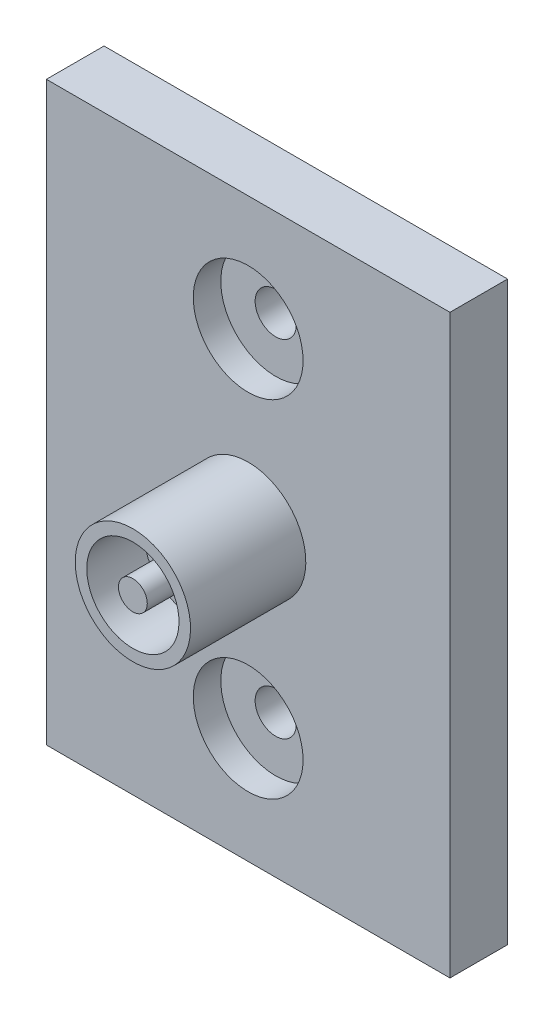
ISO-10303-21;
HEADER;
FILE_DESCRIPTION(('STEP AP214'),'2;1');
FILE_NAME('part.step','',(''),(''),'','','');
FILE_SCHEMA(('AUTOMOTIVE_DESIGN { 1 0 10303 214 1 1 1 1 }'));
ENDSEC;
DATA;
#1=APPLICATION_CONTEXT('core data for automotive mechanical design processes');
#2=APPLICATION_PROTOCOL_DEFINITION('international standard','automotive_design',2000,#1);
#3=PRODUCT_CONTEXT('',#1,'mechanical');
#4=PRODUCT('Part','Part','',(#3));
#5=PRODUCT_RELATED_PRODUCT_CATEGORY('part','',(#4));
#6=PRODUCT_DEFINITION_FORMATION('','',#4);
#7=PRODUCT_DEFINITION_CONTEXT('part definition',#1,'design');
#8=PRODUCT_DEFINITION('design','',#6,#7);
#9=PRODUCT_DEFINITION_SHAPE('','',#8);
#10=(LENGTH_UNIT() NAMED_UNIT(*) SI_UNIT(.MILLI.,.METRE.));
#11=(NAMED_UNIT(*) PLANE_ANGLE_UNIT() SI_UNIT($,.RADIAN.));
#12=(NAMED_UNIT(*) SI_UNIT($,.STERADIAN.) SOLID_ANGLE_UNIT());
#13=UNCERTAINTY_MEASURE_WITH_UNIT(LENGTH_MEASURE(1.E-05),#10,'distance_accuracy_value','');
#14=(GEOMETRIC_REPRESENTATION_CONTEXT(3) GLOBAL_UNCERTAINTY_ASSIGNED_CONTEXT((#13)) GLOBAL_UNIT_ASSIGNED_CONTEXT((#10,
#11,#12)) REPRESENTATION_CONTEXT('',''));
#15=CARTESIAN_POINT('',(0.,0.,0.));
#16=DIRECTION('',(0.,0.,1.));
#17=DIRECTION('',(1.,0.,0.));
#18=AXIS2_PLACEMENT_3D('',#15,#16,#17);
#19=CARTESIAN_POINT('',(0.,0.,5.));
#20=DIRECTION('',(0.,0.,-1.));
#21=DIRECTION('',(-1.,0.,0.));
#22=AXIS2_PLACEMENT_3D('',#19,#20,#21);
#23=PLANE('',#22);
#24=CARTESIAN_POINT('',(0.,0.,5.));
#25=DIRECTION('',(0.,0.,-1.));
#26=DIRECTION('',(0.,1.,0.));
#27=AXIS2_PLACEMENT_3D('',#24,#25,#26);
#28=CIRCLE('',#27,6.);
#29=CARTESIAN_POINT('',(0.,6.,5.));
#30=VERTEX_POINT('',#29);
#31=EDGE_CURVE('E123',#30,#30,#28,.T.);
#32=ORIENTED_EDGE('',*,*,#31,.F.);
#33=EDGE_LOOP('',(#32));
#34=FACE_BOUND('',#33,.T.);
#35=CARTESIAN_POINT('',(0.,0.,5.));
#36=DIRECTION('',(0.,0.,-1.));
#37=DIRECTION('',(-1.,0.,0.));
#38=AXIS2_PLACEMENT_3D('',#35,#36,#37);
#39=CIRCLE('',#38,2.5);
#40=CARTESIAN_POINT('',(-2.5,0.,5.));
#41=VERTEX_POINT('',#40);
#42=EDGE_CURVE('E11',#41,#41,#39,.F.);
#43=ORIENTED_EDGE('',*,*,#42,.F.);
#44=EDGE_LOOP('',(#43));
#45=FACE_BOUND('',#44,.T.);
#46=ADVANCED_FACE('F35',(#34,#45),#23,.F.);
#47=CARTESIAN_POINT('',(0.,0.,25.));
#48=DIRECTION('',(0.,0.,-1.));
#49=DIRECTION('',(-1.,0.,0.));
#50=AXIS2_PLACEMENT_3D('',#47,#48,#49);
#51=CYLINDRICAL_SURFACE('',#50,2.5);
#52=CARTESIAN_POINT('',(0.,0.,25.));
#53=DIRECTION('',(0.,0.,1.));
#54=DIRECTION('',(1.,0.,0.));
#55=AXIS2_PLACEMENT_3D('',#52,#53,#54);
#56=CIRCLE('',#55,2.5);
#57=CARTESIAN_POINT('',(2.5,0.,25.));
#58=VERTEX_POINT('',#57);
#59=EDGE_CURVE('E132',#58,#58,#56,.T.);
#60=ORIENTED_EDGE('',*,*,#59,.F.);
#61=EDGE_LOOP('',(#60));
#62=FACE_BOUND('',#61,.T.);
#63=ORIENTED_EDGE('',*,*,#42,.T.);
#64=EDGE_LOOP('',(#63));
#65=FACE_BOUND('',#64,.T.);
#66=ADVANCED_FACE('F186',(#62,#65),#51,.T.);
#67=CARTESIAN_POINT('',(0.,0.,25.));
#68=DIRECTION('',(0.,0.,1.));
#69=DIRECTION('',(1.,0.,0.));
#70=AXIS2_PLACEMENT_3D('',#67,#68,#69);
#71=PLANE('',#70);
#72=ORIENTED_EDGE('',*,*,#59,.T.);
#73=EDGE_LOOP('',(#72));
#74=FACE_BOUND('',#73,.T.);
#75=ADVANCED_FACE('F191',(#74),#71,.T.);
#76=CARTESIAN_POINT('',(0.,0.,0.));
#77=DIRECTION('',(0.,0.,-1.));
#78=DIRECTION('',(0.,1.,0.));
#79=AXIS2_PLACEMENT_3D('',#76,#77,#78);
#80=CYLINDRICAL_SURFACE('',#79,6.);
#81=CARTESIAN_POINT('',(-5.85906209348199,-1.29282302915844,15.));
#82=CARTESIAN_POINT('',(-5.8544487562277,-1.31372606120363,14.9644716502933));
#83=CARTESIAN_POINT('',(-5.85004280632662,-1.33316761483905,14.9280773081318));
#84=CARTESIAN_POINT('',(-5.8417591789342,-1.36901045878219,14.8537590894942));
#85=CARTESIAN_POINT('',(-5.83788155688046,-1.38541143010561,14.815835053047));
#86=CARTESIAN_POINT('',(-5.82721999406738,-1.42984164551734,14.7001609310232));
#87=CARTESIAN_POINT('',(-5.82139765676853,-1.45314054941397,14.6204368101892));
#88=CARTESIAN_POINT('',(-5.81302193184723,-1.48629491441645,14.4580025841804));
#89=CARTESIAN_POINT('',(-5.8104726096231,-1.49613365770553,14.3752888964652));
#90=CARTESIAN_POINT('',(-5.8089608620628,-1.50199339022866,14.2093761232951));
#91=CARTESIAN_POINT('',(-5.80999633577826,-1.49802247291131,14.1261773506709));
#92=CARTESIAN_POINT('',(-5.81548374299934,-1.47657213668072,13.9628959733192));
#93=CARTESIAN_POINT('',(-5.81988599867121,-1.45928911545826,13.8827856927722));
#94=CARTESIAN_POINT('',(-5.83153660273639,-1.4120087375848,13.7266072302169));
#95=CARTESIAN_POINT('',(-5.8387859712411,-1.38200682348893,13.6505405081059));
#96=CARTESIAN_POINT('',(-5.85542910446555,-1.309708954435,13.5034943733968));
#97=CARTESIAN_POINT('',(-5.86484988593087,-1.26725609970193,13.4325952721467));
#98=CARTESIAN_POINT('',(-5.88474426636395,-1.17139870542558,13.2988052370785));
#99=CARTESIAN_POINT('',(-5.89521794744936,-1.11799331133447,13.2359149287498));
#100=CARTESIAN_POINT('',(-5.91639592076801,-0.999972723964718,13.1180879472285));
#101=CARTESIAN_POINT('',(-5.92709848710393,-0.935086182853992,13.0634223657917));
#102=CARTESIAN_POINT('',(-5.94725302471428,-0.796900010668155,12.9657156571659));
#103=CARTESIAN_POINT('',(-5.95670495248499,-0.723600087097353,12.9226749342958));
#104=CARTESIAN_POINT('',(-5.97330598353017,-0.570555647347051,12.8494950673779));
#105=CARTESIAN_POINT('',(-5.98045482079961,-0.490810388066224,12.8193574134918));
#106=CARTESIAN_POINT('',(-5.99163389689685,-0.327169893083612,12.7729847594656));
#107=CARTESIAN_POINT('',(-5.9956647687521,-0.243275503444221,12.7567469372296));
#108=CARTESIAN_POINT('',(-6.00008465733115,-0.0760999052779219,12.7389742258584));
#109=CARTESIAN_POINT('',(-6.0005672001127,0.0071388079690795,12.737061727456));
#110=CARTESIAN_POINT('',(-5.99808466622656,0.172731674763288,12.7470088125307));
#111=CARTESIAN_POINT('',(-5.99511983549212,0.255085890986924,12.7588674135869));
#112=CARTESIAN_POINT('',(-5.9861254729971,0.415556834781913,12.7957268187328));
#113=CARTESIAN_POINT('',(-5.98013351071375,0.493712816041675,12.8205666411021));
#114=CARTESIAN_POINT('',(-5.96573954991216,0.64475844924185,12.8825198152639));
#115=CARTESIAN_POINT('',(-5.95733726652666,0.717647477424377,12.919634617872));
#116=CARTESIAN_POINT('',(-5.93881021144866,0.857686563265595,13.0059377192327));
#117=CARTESIAN_POINT('',(-5.92865441211307,0.924693067757615,13.0553521745377));
#118=CARTESIAN_POINT('',(-5.90782291147737,1.04959277055555,13.1645172969174));
#119=CARTESIAN_POINT('',(-5.89714713064798,1.10748456903325,13.2242695487095));
#120=CARTESIAN_POINT('',(-5.87618277165367,1.21387383534614,13.3540621638012));
#121=CARTESIAN_POINT('',(-5.86590877502954,1.26212421914305,13.4243077882875));
#122=CARTESIAN_POINT('',(-5.8472032468319,1.34613320113975,13.572139896401));
#123=CARTESIAN_POINT('',(-5.83877163798129,1.3818923233106,13.6497260719405));
#124=CARTESIAN_POINT('',(-5.82483041593197,1.43952347086736,13.8093329646687));
#125=CARTESIAN_POINT('',(-5.81929442313821,1.46152123922698,13.8913058698209));
#126=CARTESIAN_POINT('',(-5.81171138318686,1.49139324359333,14.0579376457271));
#127=CARTESIAN_POINT('',(-5.80966352589534,1.4992707591096,14.1425958881462));
#128=CARTESIAN_POINT('',(-5.80931642110299,1.5006134285204,14.3096130443981));
#129=CARTESIAN_POINT('',(-5.81091240033262,1.49448140320018,14.3919690017465));
#130=CARTESIAN_POINT('',(-5.81744819149207,1.46883261119017,14.5544330656184));
#131=CARTESIAN_POINT('',(-5.82238704718621,1.4493196721132,14.6345418081387));
#132=CARTESIAN_POINT('',(-5.83277456866213,1.4067797625948,14.7625734399563));
#133=CARTESIAN_POINT('',(-5.83742039444129,1.38745696170044,14.8118300560542));
#134=CARTESIAN_POINT('',(-5.84761840445142,1.34381898779569,14.9078638209715));
#135=CARTESIAN_POINT('',(-5.85316878010901,1.31951375224977,14.9546456755802));
#136=CARTESIAN_POINT('',(-5.85906209348199,1.29282302915844,15.));
#137=B_SPLINE_CURVE_WITH_KNOTS('',3,(#81,#82,#83,#84,#85,#86,#87,#88,#89,#90,#91,#92,#93,#94,
#95,#96,#97,#98,#99,#100,#101,#102,#103,#104,#105,#106,#107,#108,#109,#110,#111,#112,#113,#114,
#115,#116,#117,#118,#119,#120,#121,#122,#123,#124,#125,#126,#127,#128,#129,#130,#131,#132,#133,
#134,#135,#136),.UNSPECIFIED.,.F.,.F.,(4,2,2,2,2,2,2,2,2,2,2,2,2,2,2,2,2,2,2,2,2,2,2,2,2,2,2,4),
(0.,0.124364148412423,0.248741336362965,0.497246506346483,0.746060045883647,0.994727787475496,
1.23979551370782,1.48495112714358,1.73333951174834,1.98174728368913,2.23709063544472,
2.49244286703729,2.74782458103544,3.00315443233675,3.25172939431283,3.50028662421137,
3.74583215007225,3.99140670804812,4.24188191791826,4.49239555809707,4.74867910689668,
5.00495190407671,5.25884745416729,5.51268402791871,5.75931412582859,6.00587370456642,
6.1649391308357,6.32369033514945),.UNSPECIFIED.);
#138=CARTESIAN_POINT('',(-5.85906209348199,-1.29282302915844,15.));
#139=VERTEX_POINT('',#138);
#140=CARTESIAN_POINT('',(-5.85906209348199,1.29282302915844,15.));
#141=VERTEX_POINT('',#140);
#142=EDGE_CURVE('E117',#139,#141,#137,.T.);
#143=ORIENTED_EDGE('',*,*,#142,.F.);
#144=CARTESIAN_POINT('',(0.,0.,15.));
#145=DIRECTION('',(0.,0.,-1.));
#146=DIRECTION('',(0.,1.,0.));
#147=AXIS2_PLACEMENT_3D('',#144,#145,#146);
#148=CIRCLE('',#147,6.);
#149=EDGE_CURVE('E116',#141,#139,#148,.T.);
#150=ORIENTED_EDGE('',*,*,#149,.F.);
#151=EDGE_LOOP('',(#143,#150));
#152=FACE_BOUND('',#151,.T.);
#153=ORIENTED_EDGE('',*,*,#31,.T.);
#154=EDGE_LOOP('',(#153));
#155=FACE_BOUND('',#154,.T.);
#156=ADVANCED_FACE('F198',(#152,#155),#80,.F.);
#157=CARTESIAN_POINT('',(0.,6.,15.));
#158=DIRECTION('',(0.,0.,1.));
#159=DIRECTION('',(0.,-1.,0.));
#160=AXIS2_PLACEMENT_3D('',#157,#158,#159);
#161=PLANE('',#160);
#162=DIRECTION('',(1.,0.,0.));
#163=VECTOR('',#162,1.);
#164=CARTESIAN_POINT('',(-15.,-1.29282302915844,15.));
#165=LINE('',#164,#163);
#166=CARTESIAN_POINT('',(-7.89484696591882,-1.29282302915844,15.));
#167=VERTEX_POINT('',#166);
#168=EDGE_CURVE('E105',#167,#139,#165,.T.);
#169=ORIENTED_EDGE('',*,*,#168,.F.);
#170=CARTESIAN_POINT('',(0.,0.,15.));
#171=DIRECTION('',(0.,0.,-1.));
#172=DIRECTION('',(0.,1.,0.));
#173=AXIS2_PLACEMENT_3D('',#170,#171,#172);
#174=CIRCLE('',#173,8.);
#175=CARTESIAN_POINT('',(-7.89484696591882,1.29282302915844,15.));
#176=VERTEX_POINT('',#175);
#177=EDGE_CURVE('E114',#176,#167,#174,.T.);
#178=ORIENTED_EDGE('',*,*,#177,.F.);
#179=DIRECTION('',(1.,0.,0.));
#180=VECTOR('',#179,1.);
#181=CARTESIAN_POINT('',(-15.,1.29282302915844,15.));
#182=LINE('',#181,#180);
#183=EDGE_CURVE('E56',#141,#176,#182,.F.);
#184=ORIENTED_EDGE('',*,*,#183,.F.);
#185=ORIENTED_EDGE('',*,*,#149,.T.);
#186=EDGE_LOOP('',(#169,#178,#184,#185));
#187=FACE_BOUND('',#186,.T.);
#188=ADVANCED_FACE('F113',(#187),#161,.T.);
#189=CARTESIAN_POINT('',(0.,0.,0.));
#190=DIRECTION('',(0.,0.,-1.));
#191=DIRECTION('',(0.,1.,0.));
#192=AXIS2_PLACEMENT_3D('',#189,#190,#191);
#193=CYLINDRICAL_SURFACE('',#192,8.);
#194=CARTESIAN_POINT('',(-7.89484696591882,1.29282302915844,15.));
#195=CARTESIAN_POINT('',(-7.89836340267459,1.27134398944361,15.0365045488333));
#196=CARTESIAN_POINT('',(-7.90204177516243,1.24833660041329,15.0720695090708));
#197=CARTESIAN_POINT('',(-7.9096158574513,1.19941398132412,15.141111681313));
#198=CARTESIAN_POINT('',(-7.91351155251806,1.17349894828047,15.1745890345304));
#199=CARTESIAN_POINT('',(-7.9253559725285,1.09167745752591,15.2715053386545));
#200=CARTESIAN_POINT('',(-7.93347111768572,1.03164155209618,15.3315184691573));
#201=CARTESIAN_POINT('',(-7.94922098593206,0.902290074930788,15.4406040183404));
#202=CARTESIAN_POINT('',(-7.9568554991068,0.83297048934935,15.4896716800943));
#203=CARTESIAN_POINT('',(-7.97078730599558,0.686961979118036,15.5754675657897));
#204=CARTESIAN_POINT('',(-7.97708500356377,0.610275290280409,15.6121995183266));
#205=CARTESIAN_POINT('',(-7.98761059618587,0.452030963551578,15.6720942867126));
#206=CARTESIAN_POINT('',(-7.99184759067719,0.370496557278658,15.6953168467838));
#207=CARTESIAN_POINT('',(-7.99781420393323,0.204582301243765,15.7277214459038));
#208=CARTESIAN_POINT('',(-7.99954367257495,0.120202281427251,15.7369026443124));
#209=CARTESIAN_POINT('',(-8.00029168647187,-0.0476067552459982,15.7408926043652));
#210=CARTESIAN_POINT('',(-7.9993514685648,-0.131030468622181,15.7359199874924));
#211=CARTESIAN_POINT('',(-7.99495373828361,-0.295819563933918,15.7122313746471));
#212=CARTESIAN_POINT('',(-7.99149662494803,-0.377185270038382,15.6935175572547));
#213=CARTESIAN_POINT('',(-7.98245711745284,-0.535394503641412,15.6429869247903));
#214=CARTESIAN_POINT('',(-7.97687977516332,-0.612248283058419,15.6112012414419));
#215=CARTESIAN_POINT('',(-7.96420002499836,-0.759602588613385,15.535434953052));
#216=CARTESIAN_POINT('',(-7.95709674474642,-0.830099447640052,15.4914473679936));
#217=CARTESIAN_POINT('',(-7.94201749345682,-0.963825758399257,15.3917705443018));
#218=CARTESIAN_POINT('',(-7.93403000365688,-1.02692995803142,15.3359152586682));
#219=CARTESIAN_POINT('',(-7.91816805462666,-1.14282042535782,15.2145167126718));
#220=CARTESIAN_POINT('',(-7.91029339998464,-1.19562723819329,15.1489932109283));
#221=CARTESIAN_POINT('',(-7.90014552468695,-1.26016463057882,15.0535722362237));
#222=CARTESIAN_POINT('',(-7.89745024822377,-1.27692371406271,15.0270341896527));
#223=CARTESIAN_POINT('',(-7.89484696591882,-1.29282302915844,15.));
#224=B_SPLINE_CURVE_WITH_KNOTS('',3,(#194,#195,#196,#197,#198,#199,#200,#201,#202,#203,#204,
#205,#206,#207,#208,#209,#210,#211,#212,#213,#214,#215,#216,#217,#218,#219,#220,#221,#222,#223),
.UNSPECIFIED.,.F.,.F.,(4,2,2,2,2,2,2,2,2,2,2,2,2,2,4),(0.,0.127421791101567,0.254834953606647,
0.509350835913305,0.763977116845627,1.01852636494469,1.27194115904635,1.52537112420635,
1.77490792000268,2.02440516186305,2.27331161527216,2.52236074864473,2.7751556815891,
3.02744096331764,3.1218814125075),.UNSPECIFIED.);
#225=EDGE_CURVE('E101',#176,#167,#224,.T.);
#226=ORIENTED_EDGE('',*,*,#225,.F.);
#227=ORIENTED_EDGE('',*,*,#177,.T.);
#228=EDGE_LOOP('',(#226,#227));
#229=FACE_BOUND('',#228,.T.);
#230=CARTESIAN_POINT('',(0.,0.,25.));
#231=DIRECTION('',(0.,0.,-1.));
#232=DIRECTION('',(0.,1.,0.));
#233=AXIS2_PLACEMENT_3D('',#230,#231,#232);
#234=CIRCLE('',#233,8.00000000000001);
#235=CARTESIAN_POINT('',(0.,8.,25.));
#236=VERTEX_POINT('',#235);
#237=EDGE_CURVE('E121',#236,#236,#234,.T.);
#238=ORIENTED_EDGE('',*,*,#237,.F.);
#239=EDGE_LOOP('',(#238));
#240=FACE_BOUND('',#239,.T.);
#241=ADVANCED_FACE('F119',(#229,#240),#193,.F.);
#242=CARTESIAN_POINT('',(0.,8.,25.));
#243=DIRECTION('',(0.,0.,1.));
#244=DIRECTION('',(0.,-1.,0.));
#245=AXIS2_PLACEMENT_3D('',#242,#243,#244);
#246=PLANE('',#245);
#247=ORIENTED_EDGE('',*,*,#237,.T.);
#248=EDGE_LOOP('',(#247));
#249=FACE_BOUND('',#248,.T.);
#250=CARTESIAN_POINT('',(0.,0.,25.));
#251=DIRECTION('',(0.,0.,-1.));
#252=DIRECTION('',(0.,1.,0.));
#253=AXIS2_PLACEMENT_3D('',#250,#251,#252);
#254=CIRCLE('',#253,10.);
#255=CARTESIAN_POINT('',(0.,10.,25.));
#256=VERTEX_POINT('',#255);
#257=EDGE_CURVE('E126',#256,#256,#254,.T.);
#258=ORIENTED_EDGE('',*,*,#257,.F.);
#259=EDGE_LOOP('',(#258));
#260=FACE_BOUND('',#259,.T.);
#261=ADVANCED_FACE('F234',(#249,#260),#246,.T.);
#262=CARTESIAN_POINT('',(0.,0.,0.));
#263=DIRECTION('',(0.,0.,-1.));
#264=DIRECTION('',(0.,1.,0.));
#265=AXIS2_PLACEMENT_3D('',#262,#263,#264);
#266=CYLINDRICAL_SURFACE('',#265,10.);
#267=CARTESIAN_POINT('',(-10.,0.,12.7393367267459));
#268=CARTESIAN_POINT('',(-9.99999865771297,-0.0837515444816421,12.7393401805612));
#269=CARTESIAN_POINT('',(-9.9989368253704,-0.167551685082132,12.7463747275866));
#270=CARTESIAN_POINT('',(-9.99480315973187,-0.332809627994913,12.7743199267287));
#271=CARTESIAN_POINT('',(-9.99172936938474,-0.414265068974229,12.7952440896908));
#272=CARTESIAN_POINT('',(-9.98391721219526,-0.57241808622186,12.8503292317136));
#273=CARTESIAN_POINT('',(-9.9791801037092,-0.649119207826799,12.8844802062519));
#274=CARTESIAN_POINT('',(-9.96856475911725,-0.795690428635254,12.9650251061628));
#275=CARTESIAN_POINT('',(-9.96268668152774,-0.865561474725188,13.0114173311633));
#276=CARTESIAN_POINT('',(-9.95039170991453,-0.997046719562126,13.1155139916858));
#277=CARTESIAN_POINT('',(-9.94397133890332,-1.0585998322255,13.1732951829541));
#278=CARTESIAN_POINT('',(-9.93134261133239,-1.17117490668949,13.2983644156398));
#279=CARTESIAN_POINT('',(-9.92513426698506,-1.22219626272936,13.3656530035245));
#280=CARTESIAN_POINT('',(-9.91359877458726,-1.31249729499943,13.5082373702684));
#281=CARTESIAN_POINT('',(-9.90827611975032,-1.35171787037205,13.5835709737273));
#282=CARTESIAN_POINT('',(-9.89916211306268,-1.41692632171056,13.7398495473914));
#283=CARTESIAN_POINT('',(-9.89537067775449,-1.44291491889163,13.8207942114898));
#284=CARTESIAN_POINT('',(-9.88978256218674,-1.48073198798911,13.9853547686176));
#285=CARTESIAN_POINT('',(-9.88797115741251,-1.49266503640518,14.068946120154));
#286=CARTESIAN_POINT('',(-9.88650348970583,-1.50235624033932,14.2369628927332));
#287=CARTESIAN_POINT('',(-9.88684710303147,-1.50011520973796,14.3213882656084));
#288=CARTESIAN_POINT('',(-9.8896371835241,-1.48160733250788,14.4879378069401));
#289=CARTESIAN_POINT('',(-9.8920661876155,-1.4654569592775,14.5700752532307));
#290=CARTESIAN_POINT('',(-9.89872608126368,-1.41977117403734,14.7304610956175));
#291=CARTESIAN_POINT('',(-9.9029570217938,-1.39023538337812,14.8087093816267));
#292=CARTESIAN_POINT('',(-9.91276335545481,-1.31849603529736,14.9594500980288));
#293=CARTESIAN_POINT('',(-9.91834396766527,-1.27624314283198,15.0319186958383));
#294=CARTESIAN_POINT('',(-9.93021707574548,-1.18030413128955,15.1687813225279));
#295=CARTESIAN_POINT('',(-9.93650961832501,-1.12661726182478,15.2331748210153));
#296=CARTESIAN_POINT('',(-9.9491747305621,-1.00869493078248,15.3527343874856));
#297=CARTESIAN_POINT('',(-9.95554747112815,-0.944359329642002,15.4078017170323));
#298=CARTESIAN_POINT('',(-9.96759647648462,-0.807307089894187,15.5063726612532));
#299=CARTESIAN_POINT('',(-9.97327273822511,-0.734590414588171,15.5498762252898));
#300=CARTESIAN_POINT('',(-9.98329515585393,-0.582754598213687,15.6240898132455));
#301=CARTESIAN_POINT('',(-9.98764051925428,-0.503631677836781,15.6547922185862));
#302=CARTESIAN_POINT('',(-9.9945049055707,-0.341273182487062,15.7024461164313));
#303=CARTESIAN_POINT('',(-9.99702405195468,-0.258037885952602,15.7193985385615));
#304=CARTESIAN_POINT('',(-9.99993581133872,-0.0906695676436478,15.7389399565626));
#305=CARTESIAN_POINT('',(-10.0003485209039,-0.00655273187047159,15.7416646981253));
#306=CARTESIAN_POINT('',(-9.99905561015227,0.160936677662282,15.7330337214349));
#307=CARTESIAN_POINT('',(-9.99735005541369,0.244309274381876,15.7216784390778));
#308=CARTESIAN_POINT('',(-9.99202468615334,0.407532387431407,15.6853226265684));
#309=CARTESIAN_POINT('',(-9.98841415207985,0.487397963079838,15.6603882307151));
#310=CARTESIAN_POINT('',(-9.97968235658369,0.641814958643,15.5976517292842));
#311=CARTESIAN_POINT('',(-9.97456102421566,0.7163661287951,15.5598490194123));
#312=CARTESIAN_POINT('',(-9.96332682468687,0.85863497929192,15.4721305021821));
#313=CARTESIAN_POINT('',(-9.95720701626746,0.926299009891565,15.4221285867332));
#314=CARTESIAN_POINT('',(-9.94467863012165,1.05232367317771,15.3115509151172));
#315=CARTESIAN_POINT('',(-9.93827003562868,1.1106837647934,15.2509745444213));
#316=CARTESIAN_POINT('',(-9.92582264304494,1.21693784957195,15.1203631935694));
#317=CARTESIAN_POINT('',(-9.91978736017589,1.26474084747421,15.0502538015512));
#318=CARTESIAN_POINT('',(-9.90883219104904,1.34789129270584,14.9029206862342));
#319=CARTESIAN_POINT('',(-9.90391227465629,1.38323907656436,14.8256971552245));
#320=CARTESIAN_POINT('',(-9.89577033008645,1.44033467323943,14.6665991931228));
#321=CARTESIAN_POINT('',(-9.89254233006439,1.46213037141635,14.5847422657747));
#322=CARTESIAN_POINT('',(-9.88813382297803,1.49165549501586,14.4184777113108));
#323=CARTESIAN_POINT('',(-9.88695317451771,1.49938589183067,14.3340702607513));
#324=CARTESIAN_POINT('',(-9.88677832610842,1.5005378666944,14.1660076634302));
#325=CARTESIAN_POINT('',(-9.88776226333503,1.49410252167313,14.082353484989));
#326=CARTESIAN_POINT('',(-9.89175820611174,1.46741229544379,13.9173314634224));
#327=CARTESIAN_POINT('',(-9.89477020841118,1.44715743638627,13.8359636166325));
#328=CARTESIAN_POINT('',(-9.90247526112298,1.39345373518665,13.6778636445116));
#329=CARTESIAN_POINT('',(-9.90716703716076,1.36001489324314,13.6011280563125));
#330=CARTESIAN_POINT('',(-9.91770454557702,1.28090667642309,13.4543330929435));
#331=CARTESIAN_POINT('',(-9.92355031702724,1.23523688741502,13.3842739439423));
#332=CARTESIAN_POINT('',(-9.93580743364938,1.13244337659164,13.2520936687708));
#333=CARTESIAN_POINT('',(-9.94222367881967,1.07521369039806,13.1900553934989));
#334=CARTESIAN_POINT('',(-9.95485788826637,0.951148841082837,13.0764121719581));
#335=CARTESIAN_POINT('',(-9.96107580610759,0.884311448350942,13.0248096541698));
#336=CARTESIAN_POINT('',(-9.97265185790521,0.742495707543723,12.9332490501386));
#337=CARTESIAN_POINT('',(-9.97800507128821,0.667474576764762,12.8933566175312));
#338=CARTESIAN_POINT('',(-9.9872002880296,0.51175187024872,12.8267982099879));
#339=CARTESIAN_POINT('',(-9.99104385565757,0.431056277096705,12.8001185366922));
#340=CARTESIAN_POINT('',(-9.99590939261506,0.291665727889329,12.7667953840358));
#341=CARTESIAN_POINT('',(-9.99743549179557,0.233831133495279,12.7565141252071));
#342=CARTESIAN_POINT('',(-9.99948125947896,0.117338971600125,12.7427836290333));
#343=CARTESIAN_POINT('',(-10.0000009404878,0.0586814143344172,12.7393343067934));
#344=CARTESIAN_POINT('',(-10.,0.,12.7393367267459));
#345=B_SPLINE_CURVE_WITH_KNOTS('',3,(#267,#268,#269,#270,#271,#272,#273,#274,#275,#276,#277,
#278,#279,#280,#281,#282,#283,#284,#285,#286,#287,#288,#289,#290,#291,#292,#293,#294,#295,#296,
#297,#298,#299,#300,#301,#302,#303,#304,#305,#306,#307,#308,#309,#310,#311,#312,#313,#314,#315,
#316,#317,#318,#319,#320,#321,#322,#323,#324,#325,#326,#327,#328,#329,#330,#331,#332,#333,#334,
#335,#336,#337,#338,#339,#340,#341,#342,#343,#344),.UNSPECIFIED.,.T.,.F.,(4,2,2,2,2,2,2,2,2,2,2,
2,2,2,2,2,2,2,2,2,2,2,2,2,2,2,2,2,2,2,2,2,2,2,2,2,2,2,4),(0.,0.251040205031663,0.50232496292915,
0.753420023583237,1.0044802241976,1.25729416136843,1.5101226357258,1.76419702395375,
2.01825756225506,2.27041564605924,2.52255925098982,2.77261177195747,3.02267136690362,
3.27371383476159,3.52477278308534,3.77834291255409,4.03191415238668,4.28563608984874,
4.53934087193401,4.79062058544255,5.04189251991155,5.29195148965948,5.54202220376273,
5.79391188036907,6.04581620028629,6.29981366584671,6.55380426808832,6.80689223457168,
7.05996272137176,7.31048888261064,7.56101464229564,7.81135073984146,8.06169531466879,
8.3144482996572,8.56726003468733,8.82146323384733,9.07540233261441,9.25129851978808,
9.42719252123291),.UNSPECIFIED.);
#346=CARTESIAN_POINT('',(-10.,0.,12.7393367267459));
#347=VERTEX_POINT('',#346);
#348=EDGE_CURVE('E39',#347,#347,#345,.T.);
#349=ORIENTED_EDGE('',*,*,#348,.F.);
#350=EDGE_LOOP('',(#349));
#351=FACE_BOUND('',#350,.T.);
#352=ORIENTED_EDGE('',*,*,#257,.T.);
#353=EDGE_LOOP('',(#352));
#354=FACE_BOUND('',#353,.T.);
#355=CARTESIAN_POINT('',(0.,0.,5.));
#356=DIRECTION('',(0.,0.,-1.));
#357=DIRECTION('',(0.,1.,0.));
#358=AXIS2_PLACEMENT_3D('',#355,#356,#357);
#359=CIRCLE('',#358,10.);
#360=CARTESIAN_POINT('',(0.,10.,5.));
#361=VERTEX_POINT('',#360);
#362=EDGE_CURVE('E284',#361,#361,#359,.T.);
#363=ORIENTED_EDGE('',*,*,#362,.F.);
#364=EDGE_LOOP('',(#363));
#365=FACE_BOUND('',#364,.T.);
#366=ADVANCED_FACE('F236',(#351,#354,#365),#266,.T.);
#367=CARTESIAN_POINT('',(0.,0.,-5.));
#368=DIRECTION('',(0.,0.,-1.));
#369=DIRECTION('',(-1.,0.,0.));
#370=AXIS2_PLACEMENT_3D('',#367,#368,#369);
#371=PLANE('',#370);
#372=CARTESIAN_POINT('',(0.,-30.,-5.));
#373=DIRECTION('',(0.,0.,1.));
#374=DIRECTION('',(1.,0.,0.));
#375=AXIS2_PLACEMENT_3D('',#372,#373,#374);
#376=CIRCLE('',#375,3.57124);
#377=CARTESIAN_POINT('',(3.57124,-30.,-5.));
#378=VERTEX_POINT('',#377);
#379=EDGE_CURVE('E266',#378,#378,#376,.T.);
#380=ORIENTED_EDGE('',*,*,#379,.T.);
#381=EDGE_LOOP('',(#380));
#382=FACE_BOUND('',#381,.T.);
#383=CARTESIAN_POINT('',(0.,30.,-5.));
#384=DIRECTION('',(0.,0.,1.));
#385=DIRECTION('',(1.,0.,0.));
#386=AXIS2_PLACEMENT_3D('',#383,#384,#385);
#387=CIRCLE('',#386,3.57124);
#388=CARTESIAN_POINT('',(3.57124,30.,-5.));
#389=VERTEX_POINT('',#388);
#390=EDGE_CURVE('E281',#389,#389,#387,.T.);
#391=ORIENTED_EDGE('',*,*,#390,.T.);
#392=EDGE_LOOP('',(#391));
#393=FACE_BOUND('',#392,.T.);
#394=DIRECTION('',(0.,1.,0.));
#395=VECTOR('',#394,1.);
#396=CARTESIAN_POINT('',(35.,-50.,-5.));
#397=LINE('',#396,#395);
#398=CARTESIAN_POINT('',(35.,-50.,-5.));
#399=VERTEX_POINT('',#398);
#400=CARTESIAN_POINT('',(35.,50.,-5.));
#401=VERTEX_POINT('',#400);
#402=EDGE_CURVE('E135',#399,#401,#397,.T.);
#403=ORIENTED_EDGE('',*,*,#402,.F.);
#404=DIRECTION('',(1.,0.,0.));
#405=VECTOR('',#404,1.);
#406=CARTESIAN_POINT('',(-35.,-50.,-5.));
#407=LINE('',#406,#405);
#408=CARTESIAN_POINT('',(-35.,-50.,-5.));
#409=VERTEX_POINT('',#408);
#410=EDGE_CURVE('E86',#409,#399,#407,.T.);
#411=ORIENTED_EDGE('',*,*,#410,.F.);
#412=DIRECTION('',(0.,-1.,0.));
#413=VECTOR('',#412,1.);
#414=CARTESIAN_POINT('',(-35.,-50.,-5.));
#415=LINE('',#414,#413);
#416=CARTESIAN_POINT('',(-35.,50.,-5.));
#417=VERTEX_POINT('',#416);
#418=EDGE_CURVE('E147',#417,#409,#415,.T.);
#419=ORIENTED_EDGE('',*,*,#418,.F.);
#420=DIRECTION('',(-1.,0.,0.));
#421=VECTOR('',#420,1.);
#422=CARTESIAN_POINT('',(-35.,50.,-5.));
#423=LINE('',#422,#421);
#424=EDGE_CURVE('E145',#401,#417,#423,.T.);
#425=ORIENTED_EDGE('',*,*,#424,.F.);
#426=EDGE_LOOP('',(#403,#411,#419,#425));
#427=FACE_BOUND('',#426,.T.);
#428=ADVANCED_FACE('F162',(#382,#393,#427),#371,.T.);
#429=CARTESIAN_POINT('',(-35.,-50.,5.));
#430=DIRECTION('',(0.,1.,0.));
#431=DIRECTION('',(0.,0.,1.));
#432=AXIS2_PLACEMENT_3D('',#429,#430,#431);
#433=PLANE('',#432);
#434=ORIENTED_EDGE('',*,*,#410,.T.);
#435=DIRECTION('',(0.,0.,-1.));
#436=VECTOR('',#435,1.);
#437=CARTESIAN_POINT('',(35.,-50.,5.));
#438=LINE('',#437,#436);
#439=CARTESIAN_POINT('',(35.,-50.,5.));
#440=VERTEX_POINT('',#439);
#441=EDGE_CURVE('E142',#440,#399,#438,.T.);
#442=ORIENTED_EDGE('',*,*,#441,.F.);
#443=DIRECTION('',(1.,0.,0.));
#444=VECTOR('',#443,1.);
#445=CARTESIAN_POINT('',(-35.,-50.,5.));
#446=LINE('',#445,#444);
#447=CARTESIAN_POINT('',(-35.,-50.,5.));
#448=VERTEX_POINT('',#447);
#449=EDGE_CURVE('E65',#448,#440,#446,.T.);
#450=ORIENTED_EDGE('',*,*,#449,.F.);
#451=DIRECTION('',(0.,0.,-1.));
#452=VECTOR('',#451,1.);
#453=CARTESIAN_POINT('',(-35.,-50.,5.));
#454=LINE('',#453,#452);
#455=EDGE_CURVE('E151',#448,#409,#454,.T.);
#456=ORIENTED_EDGE('',*,*,#455,.T.);
#457=EDGE_LOOP('',(#434,#442,#450,#456));
#458=FACE_BOUND('',#457,.T.);
#459=ADVANCED_FACE('F168',(#458),#433,.F.);
#460=CARTESIAN_POINT('',(-35.,-50.,5.));
#461=DIRECTION('',(1.,0.,0.));
#462=DIRECTION('',(0.,0.,-1.));
#463=AXIS2_PLACEMENT_3D('',#460,#461,#462);
#464=PLANE('',#463);
#465=ORIENTED_EDGE('',*,*,#418,.T.);
#466=ORIENTED_EDGE('',*,*,#455,.F.);
#467=DIRECTION('',(0.,-1.,0.));
#468=VECTOR('',#467,1.);
#469=CARTESIAN_POINT('',(-35.,-50.,5.));
#470=LINE('',#469,#468);
#471=CARTESIAN_POINT('',(-35.,50.,5.));
#472=VERTEX_POINT('',#471);
#473=EDGE_CURVE('E139',#472,#448,#470,.T.);
#474=ORIENTED_EDGE('',*,*,#473,.F.);
#475=DIRECTION('',(0.,0.,-1.));
#476=VECTOR('',#475,1.);
#477=CARTESIAN_POINT('',(-35.,50.,5.));
#478=LINE('',#477,#476);
#479=EDGE_CURVE('E153',#472,#417,#478,.T.);
#480=ORIENTED_EDGE('',*,*,#479,.T.);
#481=EDGE_LOOP('',(#465,#466,#474,#480));
#482=FACE_BOUND('',#481,.T.);
#483=ADVANCED_FACE('F166',(#482),#464,.F.);
#484=CARTESIAN_POINT('',(-35.,50.,5.));
#485=DIRECTION('',(0.,-1.,0.));
#486=DIRECTION('',(0.,0.,-1.));
#487=AXIS2_PLACEMENT_3D('',#484,#485,#486);
#488=PLANE('',#487);
#489=ORIENTED_EDGE('',*,*,#424,.T.);
#490=ORIENTED_EDGE('',*,*,#479,.F.);
#491=DIRECTION('',(-1.,0.,0.));
#492=VECTOR('',#491,1.);
#493=CARTESIAN_POINT('',(-35.,50.,5.));
#494=LINE('',#493,#492);
#495=CARTESIAN_POINT('',(35.,50.,5.));
#496=VERTEX_POINT('',#495);
#497=EDGE_CURVE('E94',#496,#472,#494,.T.);
#498=ORIENTED_EDGE('',*,*,#497,.F.);
#499=DIRECTION('',(0.,0.,-1.));
#500=VECTOR('',#499,1.);
#501=CARTESIAN_POINT('',(35.,50.,5.));
#502=LINE('',#501,#500);
#503=EDGE_CURVE('E49',#496,#401,#502,.T.);
#504=ORIENTED_EDGE('',*,*,#503,.T.);
#505=EDGE_LOOP('',(#489,#490,#498,#504));
#506=FACE_BOUND('',#505,.T.);
#507=ADVANCED_FACE('F157',(#506),#488,.F.);
#508=CARTESIAN_POINT('',(35.,-50.,5.));
#509=DIRECTION('',(-1.,0.,0.));
#510=DIRECTION('',(0.,0.,1.));
#511=AXIS2_PLACEMENT_3D('',#508,#509,#510);
#512=PLANE('',#511);
#513=ORIENTED_EDGE('',*,*,#402,.T.);
#514=ORIENTED_EDGE('',*,*,#503,.F.);
#515=DIRECTION('',(0.,1.,0.));
#516=VECTOR('',#515,1.);
#517=CARTESIAN_POINT('',(35.,-50.,5.));
#518=LINE('',#517,#516);
#519=EDGE_CURVE('E136',#440,#496,#518,.T.);
#520=ORIENTED_EDGE('',*,*,#519,.F.);
#521=ORIENTED_EDGE('',*,*,#441,.T.);
#522=EDGE_LOOP('',(#513,#514,#520,#521));
#523=FACE_BOUND('',#522,.T.);
#524=ADVANCED_FACE('F37',(#523),#512,.F.);
#525=CARTESIAN_POINT('',(0.,-30.,5.));
#526=DIRECTION('',(0.,0.,1.));
#527=DIRECTION('',(1.,0.,0.));
#528=AXIS2_PLACEMENT_3D('',#525,#526,#527);
#529=CIRCLE('',#528,9.525);
#530=CARTESIAN_POINT('',(9.525,-30.,5.));
#531=VERTEX_POINT('',#530);
#532=EDGE_CURVE('E217',#531,#531,#529,.T.);
#533=ORIENTED_EDGE('',*,*,#532,.F.);
#534=EDGE_LOOP('',(#533));
#535=FACE_BOUND('',#534,.T.);
#536=CARTESIAN_POINT('',(0.,30.,5.));
#537=DIRECTION('',(0.,0.,1.));
#538=DIRECTION('',(1.,0.,0.));
#539=AXIS2_PLACEMENT_3D('',#536,#537,#538);
#540=CIRCLE('',#539,9.525);
#541=CARTESIAN_POINT('',(9.525,30.,5.));
#542=VERTEX_POINT('',#541);
#543=EDGE_CURVE('E272',#542,#542,#540,.T.);
#544=ORIENTED_EDGE('',*,*,#543,.F.);
#545=EDGE_LOOP('',(#544));
#546=FACE_BOUND('',#545,.T.);
#547=ORIENTED_EDGE('',*,*,#362,.T.);
#548=EDGE_LOOP('',(#547));
#549=FACE_BOUND('',#548,.T.);
#550=ORIENTED_EDGE('',*,*,#519,.T.);
#551=ORIENTED_EDGE('',*,*,#497,.T.);
#552=ORIENTED_EDGE('',*,*,#473,.T.);
#553=ORIENTED_EDGE('',*,*,#449,.T.);
#554=EDGE_LOOP('',(#550,#551,#552,#553));
#555=FACE_BOUND('',#554,.T.);
#556=ADVANCED_FACE('F169',(#535,#546,#549,#555),#23,.F.);
#557=CARTESIAN_POINT('',(0.,30.,5.));
#558=DIRECTION('',(0.,0.,1.));
#559=DIRECTION('',(1.,0.,0.));
#560=AXIS2_PLACEMENT_3D('',#557,#558,#559);
#561=CYLINDRICAL_SURFACE('',#560,3.57124);
#562=ORIENTED_EDGE('',*,*,#390,.F.);
#563=EDGE_LOOP('',(#562));
#564=FACE_BOUND('',#563,.T.);
#565=CARTESIAN_POINT('',(0.,30.,0.2248));
#566=DIRECTION('',(0.,0.,1.));
#567=DIRECTION('',(1.,0.,0.));
#568=AXIS2_PLACEMENT_3D('',#565,#566,#567);
#569=CIRCLE('',#568,3.57124);
#570=CARTESIAN_POINT('',(3.57124,30.,0.2248));
#571=VERTEX_POINT('',#570);
#572=EDGE_CURVE('E278',#571,#571,#569,.T.);
#573=ORIENTED_EDGE('',*,*,#572,.T.);
#574=EDGE_LOOP('',(#573));
#575=FACE_BOUND('',#574,.T.);
#576=ADVANCED_FACE('F171',(#564,#575),#561,.F.);
#577=CARTESIAN_POINT('',(3.57124,30.,0.2248));
#578=DIRECTION('',(0.,0.,-1.));
#579=DIRECTION('',(-1.,0.,0.));
#580=AXIS2_PLACEMENT_3D('',#577,#578,#579);
#581=PLANE('',#580);
#582=ORIENTED_EDGE('',*,*,#572,.F.);
#583=EDGE_LOOP('',(#582));
#584=FACE_BOUND('',#583,.T.);
#585=CARTESIAN_POINT('',(0.,30.,0.2248));
#586=DIRECTION('',(0.,0.,1.));
#587=DIRECTION('',(1.,0.,0.));
#588=AXIS2_PLACEMENT_3D('',#585,#586,#587);
#589=CIRCLE('',#588,9.525);
#590=CARTESIAN_POINT('',(9.525,30.,0.2248));
#591=VERTEX_POINT('',#590);
#592=EDGE_CURVE('E275',#591,#591,#589,.T.);
#593=ORIENTED_EDGE('',*,*,#592,.T.);
#594=EDGE_LOOP('',(#593));
#595=FACE_BOUND('',#594,.T.);
#596=ADVANCED_FACE('F178',(#584,#595),#581,.F.);
#597=CARTESIAN_POINT('',(0.,30.,5.));
#598=DIRECTION('',(0.,0.,1.));
#599=DIRECTION('',(1.,0.,0.));
#600=AXIS2_PLACEMENT_3D('',#597,#598,#599);
#601=CYLINDRICAL_SURFACE('',#600,9.525);
#602=ORIENTED_EDGE('',*,*,#592,.F.);
#603=EDGE_LOOP('',(#602));
#604=FACE_BOUND('',#603,.T.);
#605=ORIENTED_EDGE('',*,*,#543,.T.);
#606=EDGE_LOOP('',(#605));
#607=FACE_BOUND('',#606,.T.);
#608=ADVANCED_FACE('F244',(#604,#607),#601,.F.);
#609=CARTESIAN_POINT('',(0.,-30.,5.));
#610=DIRECTION('',(0.,0.,1.));
#611=DIRECTION('',(1.,0.,0.));
#612=AXIS2_PLACEMENT_3D('',#609,#610,#611);
#613=CYLINDRICAL_SURFACE('',#612,3.57124);
#614=ORIENTED_EDGE('',*,*,#379,.F.);
#615=EDGE_LOOP('',(#614));
#616=FACE_BOUND('',#615,.T.);
#617=CARTESIAN_POINT('',(0.,-30.,0.2248));
#618=DIRECTION('',(0.,0.,1.));
#619=DIRECTION('',(1.,0.,0.));
#620=AXIS2_PLACEMENT_3D('',#617,#618,#619);
#621=CIRCLE('',#620,3.57124);
#622=CARTESIAN_POINT('',(3.57124,-30.,0.2248));
#623=VERTEX_POINT('',#622);
#624=EDGE_CURVE('E262',#623,#623,#621,.T.);
#625=ORIENTED_EDGE('',*,*,#624,.T.);
#626=EDGE_LOOP('',(#625));
#627=FACE_BOUND('',#626,.T.);
#628=ADVANCED_FACE('F248',(#616,#627),#613,.F.);
#629=CARTESIAN_POINT('',(3.57124,-30.,0.2248));
#630=DIRECTION('',(0.,0.,-1.));
#631=DIRECTION('',(-1.,0.,0.));
#632=AXIS2_PLACEMENT_3D('',#629,#630,#631);
#633=PLANE('',#632);
#634=ORIENTED_EDGE('',*,*,#624,.F.);
#635=EDGE_LOOP('',(#634));
#636=FACE_BOUND('',#635,.T.);
#637=CARTESIAN_POINT('',(0.,-30.,0.2248));
#638=DIRECTION('',(0.,0.,1.));
#639=DIRECTION('',(1.,0.,0.));
#640=AXIS2_PLACEMENT_3D('',#637,#638,#639);
#641=CIRCLE('',#640,9.525);
#642=CARTESIAN_POINT('',(9.525,-30.,0.2248));
#643=VERTEX_POINT('',#642);
#644=EDGE_CURVE('E265',#643,#643,#641,.T.);
#645=ORIENTED_EDGE('',*,*,#644,.T.);
#646=EDGE_LOOP('',(#645));
#647=FACE_BOUND('',#646,.T.);
#648=ADVANCED_FACE('F251',(#636,#647),#633,.F.);
#649=CARTESIAN_POINT('',(0.,-30.,5.));
#650=DIRECTION('',(0.,0.,1.));
#651=DIRECTION('',(1.,0.,0.));
#652=AXIS2_PLACEMENT_3D('',#649,#650,#651);
#653=CYLINDRICAL_SURFACE('',#652,9.525);
#654=ORIENTED_EDGE('',*,*,#644,.F.);
#655=EDGE_LOOP('',(#654));
#656=FACE_BOUND('',#655,.T.);
#657=ORIENTED_EDGE('',*,*,#532,.T.);
#658=EDGE_LOOP('',(#657));
#659=FACE_BOUND('',#658,.T.);
#660=ADVANCED_FACE('F223',(#656,#659),#653,.F.);
#661=CARTESIAN_POINT('',(-15.,0.,14.2393367267459));
#662=DIRECTION('',(1.,0.,0.));
#663=DIRECTION('',(0.,0.,-1.));
#664=AXIS2_PLACEMENT_3D('',#661,#662,#663);
#665=CYLINDRICAL_SURFACE('',#664,1.5);
#666=ORIENTED_EDGE('',*,*,#142,.T.);
#667=ORIENTED_EDGE('',*,*,#183,.T.);
#668=ORIENTED_EDGE('',*,*,#225,.T.);
#669=ORIENTED_EDGE('',*,*,#168,.T.);
#670=EDGE_LOOP('',(#666,#667,#668,#669));
#671=FACE_BOUND('',#670,.T.);
#672=ORIENTED_EDGE('',*,*,#348,.T.);
#673=EDGE_LOOP('',(#672));
#674=FACE_BOUND('',#673,.T.);
#675=ADVANCED_FACE('F103',(#671,#674),#665,.F.);
#676=CLOSED_SHELL('',(#46,#66,#75,#156,#188,#241,#261,#366,#428,#459,#483,#507,#524,#556,#576,
#596,#608,#628,#648,#660,#675));
#677=MANIFOLD_SOLID_BREP('B2',#676);
#678=ADVANCED_BREP_SHAPE_REPRESENTATION('',(#18,#677),#14);
#679=SHAPE_DEFINITION_REPRESENTATION(#9,#678);
ENDSEC;
END-ISO-10303-21;
